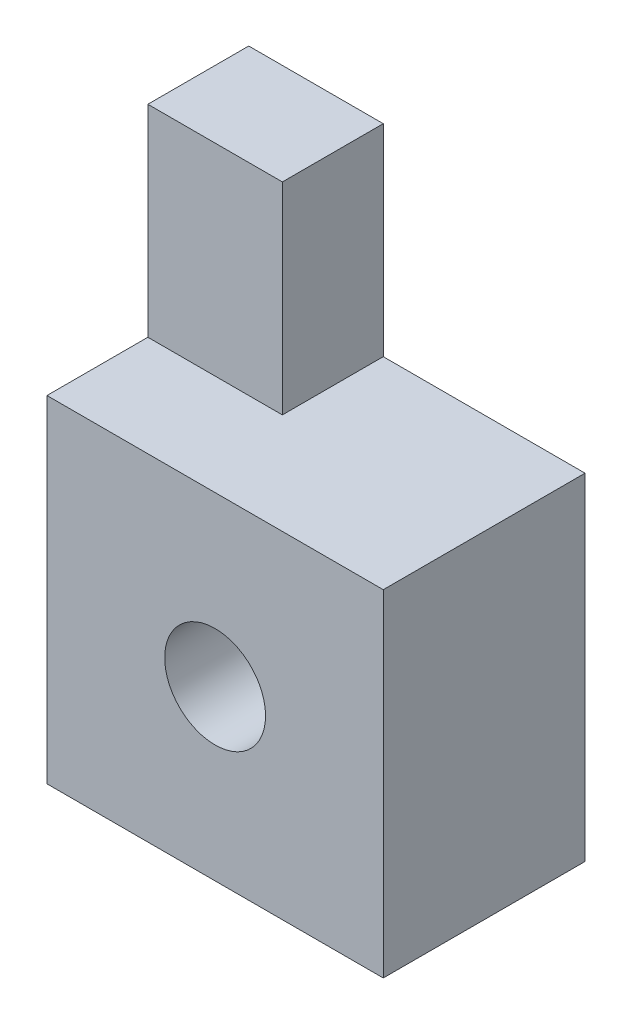
ISO-10303-21;
HEADER;
FILE_DESCRIPTION(('STEP AP214'),'2;1');
FILE_NAME('part.step','',(''),(''),'','','');
FILE_SCHEMA(('AUTOMOTIVE_DESIGN { 1 0 10303 214 1 1 1 1 }'));
ENDSEC;
DATA;
#1=APPLICATION_CONTEXT('core data for automotive mechanical design processes');
#2=APPLICATION_PROTOCOL_DEFINITION('international standard','automotive_design',2000,#1);
#3=PRODUCT_CONTEXT('',#1,'mechanical');
#4=PRODUCT('Part','Part','',(#3));
#5=PRODUCT_RELATED_PRODUCT_CATEGORY('part','',(#4));
#6=PRODUCT_DEFINITION_FORMATION('','',#4);
#7=PRODUCT_DEFINITION_CONTEXT('part definition',#1,'design');
#8=PRODUCT_DEFINITION('design','',#6,#7);
#9=PRODUCT_DEFINITION_SHAPE('','',#8);
#10=(LENGTH_UNIT() NAMED_UNIT(*) SI_UNIT(.MILLI.,.METRE.));
#11=(NAMED_UNIT(*) PLANE_ANGLE_UNIT() SI_UNIT($,.RADIAN.));
#12=(NAMED_UNIT(*) SI_UNIT($,.STERADIAN.) SOLID_ANGLE_UNIT());
#13=UNCERTAINTY_MEASURE_WITH_UNIT(LENGTH_MEASURE(1.E-05),#10,'distance_accuracy_value','');
#14=(GEOMETRIC_REPRESENTATION_CONTEXT(3) GLOBAL_UNCERTAINTY_ASSIGNED_CONTEXT((#13)) GLOBAL_UNIT_ASSIGNED_CONTEXT((#10,
#11,#12)) REPRESENTATION_CONTEXT('',''));
#15=CARTESIAN_POINT('',(0.,0.,0.));
#16=DIRECTION('',(0.,0.,1.));
#17=DIRECTION('',(1.,0.,0.));
#18=AXIS2_PLACEMENT_3D('',#15,#16,#17);
#19=CARTESIAN_POINT('',(25.,25.,30.));
#20=DIRECTION('',(0.,-1.,0.));
#21=DIRECTION('',(1.,0.,0.));
#22=AXIS2_PLACEMENT_3D('',#19,#20,#21);
#23=PLANE('',#22);
#24=DIRECTION('',(0.,0.,-1.));
#25=VECTOR('',#24,1.);
#26=CARTESIAN_POINT('',(-5.,25.,0.));
#27=LINE('',#26,#25);
#28=CARTESIAN_POINT('',(-5.,25.,15.));
#29=VERTEX_POINT('',#28);
#30=CARTESIAN_POINT('',(-5.,25.,0.));
#31=VERTEX_POINT('',#30);
#32=EDGE_CURVE('E135',#29,#31,#27,.T.);
#33=ORIENTED_EDGE('',*,*,#32,.F.);
#34=DIRECTION('',(1.,0.,0.));
#35=VECTOR('',#34,1.);
#36=CARTESIAN_POINT('',(-25.,25.,15.));
#37=LINE('',#36,#35);
#38=CARTESIAN_POINT('',(-25.,25.,15.));
#39=VERTEX_POINT('',#38);
#40=EDGE_CURVE('E69',#39,#29,#37,.T.);
#41=ORIENTED_EDGE('',*,*,#40,.F.);
#42=DIRECTION('',(0.,0.,-1.));
#43=VECTOR('',#42,1.);
#44=CARTESIAN_POINT('',(-25.,25.,30.));
#45=LINE('',#44,#43);
#46=CARTESIAN_POINT('',(-25.,25.,30.));
#47=VERTEX_POINT('',#46);
#48=EDGE_CURVE('E138',#47,#39,#45,.T.);
#49=ORIENTED_EDGE('',*,*,#48,.F.);
#50=DIRECTION('',(-1.,0.,0.));
#51=VECTOR('',#50,1.);
#52=CARTESIAN_POINT('',(25.,25.,30.));
#53=LINE('',#52,#51);
#54=CARTESIAN_POINT('',(25.,25.,30.));
#55=VERTEX_POINT('',#54);
#56=EDGE_CURVE('E165',#55,#47,#53,.T.);
#57=ORIENTED_EDGE('',*,*,#56,.F.);
#58=DIRECTION('',(0.,0.,-1.));
#59=VECTOR('',#58,1.);
#60=CARTESIAN_POINT('',(25.,25.,30.));
#61=LINE('',#60,#59);
#62=CARTESIAN_POINT('',(25.,25.,0.));
#63=VERTEX_POINT('',#62);
#64=EDGE_CURVE('E180',#55,#63,#61,.T.);
#65=ORIENTED_EDGE('',*,*,#64,.T.);
#66=DIRECTION('',(-1.,0.,0.));
#67=VECTOR('',#66,1.);
#68=CARTESIAN_POINT('',(25.,25.,0.));
#69=LINE('',#68,#67);
#70=EDGE_CURVE('E75',#63,#31,#69,.T.);
#71=ORIENTED_EDGE('',*,*,#70,.T.);
#72=EDGE_LOOP('',(#33,#41,#49,#57,#65,#71));
#73=FACE_BOUND('',#72,.T.);
#74=ADVANCED_FACE('F53',(#73),#23,.F.);
#75=CARTESIAN_POINT('',(-25.,25.,30.));
#76=DIRECTION('',(1.,0.,0.));
#77=DIRECTION('',(0.,1.,0.));
#78=AXIS2_PLACEMENT_3D('',#75,#76,#77);
#79=PLANE('',#78);
#80=DIRECTION('',(0.,-1.,0.));
#81=VECTOR('',#80,1.);
#82=CARTESIAN_POINT('',(-25.,25.,0.));
#83=LINE('',#82,#81);
#84=CARTESIAN_POINT('',(-25.,55.,0.));
#85=VERTEX_POINT('',#84);
#86=CARTESIAN_POINT('',(-25.,-25.,0.));
#87=VERTEX_POINT('',#86);
#88=EDGE_CURVE('E153',#85,#87,#83,.T.);
#89=ORIENTED_EDGE('',*,*,#88,.T.);
#90=DIRECTION('',(0.,0.,-1.));
#91=VECTOR('',#90,1.);
#92=CARTESIAN_POINT('',(-25.,-25.,30.));
#93=LINE('',#92,#91);
#94=CARTESIAN_POINT('',(-25.,-25.,30.));
#95=VERTEX_POINT('',#94);
#96=EDGE_CURVE('E13',#95,#87,#93,.T.);
#97=ORIENTED_EDGE('',*,*,#96,.F.);
#98=DIRECTION('',(0.,-1.,0.));
#99=VECTOR('',#98,1.);
#100=CARTESIAN_POINT('',(-25.,25.,30.));
#101=LINE('',#100,#99);
#102=EDGE_CURVE('E155',#47,#95,#101,.T.);
#103=ORIENTED_EDGE('',*,*,#102,.F.);
#104=ORIENTED_EDGE('',*,*,#48,.T.);
#105=DIRECTION('',(0.,-1.,0.));
#106=VECTOR('',#105,1.);
#107=CARTESIAN_POINT('',(-25.,55.,15.));
#108=LINE('',#107,#106);
#109=CARTESIAN_POINT('',(-25.,55.,15.));
#110=VERTEX_POINT('',#109);
#111=EDGE_CURVE('E118',#110,#39,#108,.T.);
#112=ORIENTED_EDGE('',*,*,#111,.F.);
#113=DIRECTION('',(0.,0.,1.));
#114=VECTOR('',#113,1.);
#115=CARTESIAN_POINT('',(-25.,55.,0.));
#116=LINE('',#115,#114);
#117=EDGE_CURVE('E125',#85,#110,#116,.T.);
#118=ORIENTED_EDGE('',*,*,#117,.F.);
#119=EDGE_LOOP('',(#89,#97,#103,#104,#112,#118));
#120=FACE_BOUND('',#119,.T.);
#121=ADVANCED_FACE('F55',(#120),#79,.F.);
#122=CARTESIAN_POINT('',(25.,-25.,30.));
#123=DIRECTION('',(0.,1.,0.));
#124=DIRECTION('',(-1.,0.,0.));
#125=AXIS2_PLACEMENT_3D('',#122,#123,#124);
#126=PLANE('',#125);
#127=DIRECTION('',(1.,0.,0.));
#128=VECTOR('',#127,1.);
#129=CARTESIAN_POINT('',(25.,-25.,0.));
#130=LINE('',#129,#128);
#131=CARTESIAN_POINT('',(25.,-25.,0.));
#132=VERTEX_POINT('',#131);
#133=EDGE_CURVE('E170',#87,#132,#130,.T.);
#134=ORIENTED_EDGE('',*,*,#133,.T.);
#135=DIRECTION('',(0.,0.,-1.));
#136=VECTOR('',#135,1.);
#137=CARTESIAN_POINT('',(25.,-25.,30.));
#138=LINE('',#137,#136);
#139=CARTESIAN_POINT('',(25.,-25.,30.));
#140=VERTEX_POINT('',#139);
#141=EDGE_CURVE('E62',#140,#132,#138,.T.);
#142=ORIENTED_EDGE('',*,*,#141,.F.);
#143=DIRECTION('',(1.,0.,0.));
#144=VECTOR('',#143,1.);
#145=CARTESIAN_POINT('',(25.,-25.,30.));
#146=LINE('',#145,#144);
#147=EDGE_CURVE('E159',#95,#140,#146,.T.);
#148=ORIENTED_EDGE('',*,*,#147,.F.);
#149=ORIENTED_EDGE('',*,*,#96,.T.);
#150=EDGE_LOOP('',(#134,#142,#148,#149));
#151=FACE_BOUND('',#150,.T.);
#152=ADVANCED_FACE('F211',(#151),#126,.F.);
#153=CARTESIAN_POINT('',(25.,25.,30.));
#154=DIRECTION('',(-1.,0.,0.));
#155=DIRECTION('',(0.,-1.,0.));
#156=AXIS2_PLACEMENT_3D('',#153,#154,#155);
#157=PLANE('',#156);
#158=DIRECTION('',(0.,1.,0.));
#159=VECTOR('',#158,1.);
#160=CARTESIAN_POINT('',(25.,25.,0.));
#161=LINE('',#160,#159);
#162=EDGE_CURVE('E173',#132,#63,#161,.T.);
#163=ORIENTED_EDGE('',*,*,#162,.T.);
#164=ORIENTED_EDGE('',*,*,#64,.F.);
#165=DIRECTION('',(0.,1.,0.));
#166=VECTOR('',#165,1.);
#167=CARTESIAN_POINT('',(25.,25.,30.));
#168=LINE('',#167,#166);
#169=EDGE_CURVE('E162',#140,#55,#168,.T.);
#170=ORIENTED_EDGE('',*,*,#169,.F.);
#171=ORIENTED_EDGE('',*,*,#141,.T.);
#172=EDGE_LOOP('',(#163,#164,#170,#171));
#173=FACE_BOUND('',#172,.T.);
#174=ADVANCED_FACE('F188',(#173),#157,.F.);
#175=CARTESIAN_POINT('',(0.,0.,30.));
#176=DIRECTION('',(0.,0.,-1.));
#177=DIRECTION('',(-1.,0.,0.));
#178=AXIS2_PLACEMENT_3D('',#175,#176,#177);
#179=PLANE('',#178);
#180=CARTESIAN_POINT('',(0.,0.,30.));
#181=DIRECTION('',(0.,0.,1.));
#182=DIRECTION('',(1.,0.,0.));
#183=AXIS2_PLACEMENT_3D('',#180,#181,#182);
#184=CIRCLE('',#183,7.5);
#185=CARTESIAN_POINT('',(7.5,0.,30.));
#186=VERTEX_POINT('',#185);
#187=EDGE_CURVE('E145',#186,#186,#184,.T.);
#188=ORIENTED_EDGE('',*,*,#187,.F.);
#189=EDGE_LOOP('',(#188));
#190=FACE_BOUND('',#189,.T.);
#191=ORIENTED_EDGE('',*,*,#102,.T.);
#192=ORIENTED_EDGE('',*,*,#147,.T.);
#193=ORIENTED_EDGE('',*,*,#169,.T.);
#194=ORIENTED_EDGE('',*,*,#56,.T.);
#195=EDGE_LOOP('',(#191,#192,#193,#194));
#196=FACE_BOUND('',#195,.T.);
#197=ADVANCED_FACE('F216',(#190,#196),#179,.F.);
#198=CARTESIAN_POINT('',(0.,0.,0.));
#199=DIRECTION('',(0.,0.,-1.));
#200=DIRECTION('',(-1.,0.,0.));
#201=AXIS2_PLACEMENT_3D('',#198,#199,#200);
#202=PLANE('',#201);
#203=CARTESIAN_POINT('',(0.,0.,0.));
#204=DIRECTION('',(0.,0.,-1.));
#205=DIRECTION('',(-1.,0.,0.));
#206=AXIS2_PLACEMENT_3D('',#203,#204,#205);
#207=CIRCLE('',#206,7.5);
#208=CARTESIAN_POINT('',(-7.5,0.,0.));
#209=VERTEX_POINT('',#208);
#210=EDGE_CURVE('E140',#209,#209,#207,.F.);
#211=ORIENTED_EDGE('',*,*,#210,.T.);
#212=EDGE_LOOP('',(#211));
#213=FACE_BOUND('',#212,.T.);
#214=ORIENTED_EDGE('',*,*,#88,.F.);
#215=DIRECTION('',(-1.,0.,0.));
#216=VECTOR('',#215,1.);
#217=CARTESIAN_POINT('',(-25.,55.,0.));
#218=LINE('',#217,#216);
#219=CARTESIAN_POINT('',(-5.00000000000001,55.,0.));
#220=VERTEX_POINT('',#219);
#221=EDGE_CURVE('E131',#220,#85,#218,.T.);
#222=ORIENTED_EDGE('',*,*,#221,.F.);
#223=DIRECTION('',(0.,-1.,0.));
#224=VECTOR('',#223,1.);
#225=CARTESIAN_POINT('',(-5.00000000000001,55.,0.));
#226=LINE('',#225,#224);
#227=EDGE_CURVE('E147',#220,#31,#226,.T.);
#228=ORIENTED_EDGE('',*,*,#227,.T.);
#229=ORIENTED_EDGE('',*,*,#70,.F.);
#230=ORIENTED_EDGE('',*,*,#162,.F.);
#231=ORIENTED_EDGE('',*,*,#133,.F.);
#232=EDGE_LOOP('',(#214,#222,#228,#229,#230,#231));
#233=FACE_BOUND('',#232,.T.);
#234=ADVANCED_FACE('F192',(#213,#233),#202,.T.);
#235=CARTESIAN_POINT('',(0.,0.,-0.001000000000001));
#236=DIRECTION('',(0.,0.,1.));
#237=DIRECTION('',(1.,0.,0.));
#238=AXIS2_PLACEMENT_3D('',#235,#236,#237);
#239=CYLINDRICAL_SURFACE('',#238,7.5);
#240=ORIENTED_EDGE('',*,*,#210,.F.);
#241=EDGE_LOOP('',(#240));
#242=FACE_BOUND('',#241,.T.);
#243=ORIENTED_EDGE('',*,*,#187,.T.);
#244=EDGE_LOOP('',(#243));
#245=FACE_BOUND('',#244,.T.);
#246=ADVANCED_FACE('F228',(#242,#245),#239,.F.);
#247=CARTESIAN_POINT('',(-25.,55.,15.));
#248=DIRECTION('',(0.,0.,-1.));
#249=DIRECTION('',(-1.,0.,0.));
#250=AXIS2_PLACEMENT_3D('',#247,#248,#249);
#251=PLANE('',#250);
#252=ORIENTED_EDGE('',*,*,#40,.T.);
#253=DIRECTION('',(0.,-1.,0.));
#254=VECTOR('',#253,1.);
#255=CARTESIAN_POINT('',(-5.00000000000001,55.,15.));
#256=LINE('',#255,#254);
#257=CARTESIAN_POINT('',(-5.00000000000001,55.,15.));
#258=VERTEX_POINT('',#257);
#259=EDGE_CURVE('E120',#258,#29,#256,.T.);
#260=ORIENTED_EDGE('',*,*,#259,.F.);
#261=DIRECTION('',(1.,0.,0.));
#262=VECTOR('',#261,1.);
#263=CARTESIAN_POINT('',(-25.,55.,15.));
#264=LINE('',#263,#262);
#265=EDGE_CURVE('E114',#110,#258,#264,.T.);
#266=ORIENTED_EDGE('',*,*,#265,.F.);
#267=ORIENTED_EDGE('',*,*,#111,.T.);
#268=EDGE_LOOP('',(#252,#260,#266,#267));
#269=FACE_BOUND('',#268,.T.);
#270=ADVANCED_FACE('F116',(#269),#251,.F.);
#271=CARTESIAN_POINT('',(-5.00000000000001,55.,0.));
#272=DIRECTION('',(-1.,0.,0.));
#273=DIRECTION('',(0.,0.,1.));
#274=AXIS2_PLACEMENT_3D('',#271,#272,#273);
#275=PLANE('',#274);
#276=ORIENTED_EDGE('',*,*,#32,.T.);
#277=ORIENTED_EDGE('',*,*,#227,.F.);
#278=DIRECTION('',(0.,0.,-1.));
#279=VECTOR('',#278,1.);
#280=CARTESIAN_POINT('',(-5.00000000000001,55.,0.));
#281=LINE('',#280,#279);
#282=EDGE_CURVE('E124',#258,#220,#281,.T.);
#283=ORIENTED_EDGE('',*,*,#282,.F.);
#284=ORIENTED_EDGE('',*,*,#259,.T.);
#285=EDGE_LOOP('',(#276,#277,#283,#284));
#286=FACE_BOUND('',#285,.T.);
#287=ADVANCED_FACE('F205',(#286),#275,.F.);
#288=CARTESIAN_POINT('',(0.,55.,0.));
#289=DIRECTION('',(0.,1.,0.));
#290=DIRECTION('',(-1.,0.,0.));
#291=AXIS2_PLACEMENT_3D('',#288,#289,#290);
#292=PLANE('',#291);
#293=ORIENTED_EDGE('',*,*,#117,.T.);
#294=ORIENTED_EDGE('',*,*,#265,.T.);
#295=ORIENTED_EDGE('',*,*,#282,.T.);
#296=ORIENTED_EDGE('',*,*,#221,.T.);
#297=EDGE_LOOP('',(#293,#294,#295,#296));
#298=FACE_BOUND('',#297,.T.);
#299=ADVANCED_FACE('F129',(#298),#292,.T.);
#300=CLOSED_SHELL('',(#74,#121,#152,#174,#197,#234,#246,#270,#287,#299));
#301=MANIFOLD_SOLID_BREP('B2',#300);
#302=ADVANCED_BREP_SHAPE_REPRESENTATION('',(#18,#301),#14);
#303=SHAPE_DEFINITION_REPRESENTATION(#9,#302);
ENDSEC;
END-ISO-10303-21;
